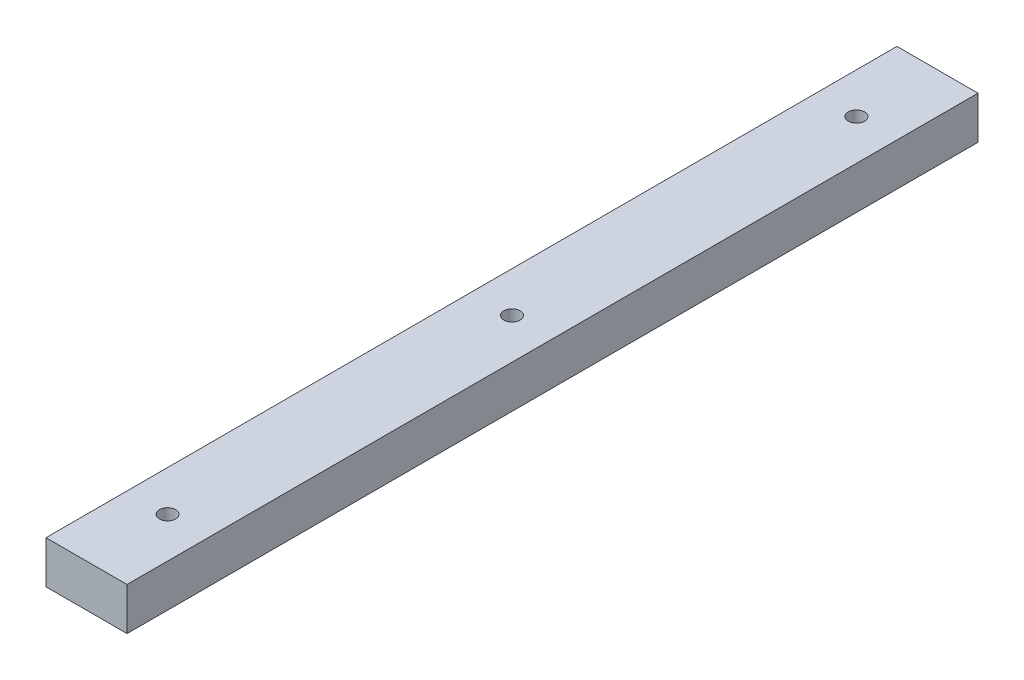
ISO-10303-21;
HEADER;
FILE_DESCRIPTION(('STEP AP214'),'2;1');
FILE_NAME('part.step','',(''),(''),'','','');
FILE_SCHEMA(('AUTOMOTIVE_DESIGN { 1 0 10303 214 1 1 1 1 }'));
ENDSEC;
DATA;
#1=APPLICATION_CONTEXT('core data for automotive mechanical design processes');
#2=APPLICATION_PROTOCOL_DEFINITION('international standard','automotive_design',2000,#1);
#3=PRODUCT_CONTEXT('',#1,'mechanical');
#4=PRODUCT('Part','Part','',(#3));
#5=PRODUCT_RELATED_PRODUCT_CATEGORY('part','',(#4));
#6=PRODUCT_DEFINITION_FORMATION('','',#4);
#7=PRODUCT_DEFINITION_CONTEXT('part definition',#1,'design');
#8=PRODUCT_DEFINITION('design','',#6,#7);
#9=PRODUCT_DEFINITION_SHAPE('','',#8);
#10=(LENGTH_UNIT() NAMED_UNIT(*) SI_UNIT(.MILLI.,.METRE.));
#11=(NAMED_UNIT(*) PLANE_ANGLE_UNIT() SI_UNIT($,.RADIAN.));
#12=(NAMED_UNIT(*) SI_UNIT($,.STERADIAN.) SOLID_ANGLE_UNIT());
#13=UNCERTAINTY_MEASURE_WITH_UNIT(LENGTH_MEASURE(1.E-05),#10,'distance_accuracy_value','');
#14=(GEOMETRIC_REPRESENTATION_CONTEXT(3) GLOBAL_UNCERTAINTY_ASSIGNED_CONTEXT((#13)) GLOBAL_UNIT_ASSIGNED_CONTEXT((#10,
#11,#12)) REPRESENTATION_CONTEXT('',''));
#15=CARTESIAN_POINT('',(0.,0.,0.));
#16=DIRECTION('',(0.,0.,1.));
#17=DIRECTION('',(1.,0.,0.));
#18=AXIS2_PLACEMENT_3D('',#15,#16,#17);
#19=CARTESIAN_POINT('',(0.,10.5,0.));
#20=DIRECTION('',(0.,-1.,0.));
#21=DIRECTION('',(0.,0.,-1.));
#22=AXIS2_PLACEMENT_3D('',#19,#20,#21);
#23=PLANE('',#22);
#24=DIRECTION('',(0.,0.,-1.));
#25=VECTOR('',#24,1.);
#26=CARTESIAN_POINT('',(10.0000000000001,10.5,105.));
#27=LINE('',#26,#25);
#28=CARTESIAN_POINT('',(10.0000000000001,10.5,105.));
#29=VERTEX_POINT('',#28);
#30=CARTESIAN_POINT('',(10.0000000000001,10.5,-105.));
#31=VERTEX_POINT('',#30);
#32=EDGE_CURVE('E96',#29,#31,#27,.T.);
#33=ORIENTED_EDGE('',*,*,#32,.T.);
#34=DIRECTION('',(-1.,0.,0.));
#35=VECTOR('',#34,1.);
#36=CARTESIAN_POINT('',(-9.99999999999994,10.5,-105.));
#37=LINE('',#36,#35);
#38=CARTESIAN_POINT('',(-9.99999999999994,10.5,-105.));
#39=VERTEX_POINT('',#38);
#40=EDGE_CURVE('E91',#31,#39,#37,.T.);
#41=ORIENTED_EDGE('',*,*,#40,.T.);
#42=DIRECTION('',(0.,0.,1.));
#43=VECTOR('',#42,1.);
#44=CARTESIAN_POINT('',(-10.0000000000001,10.5,105.));
#45=LINE('',#44,#43);
#46=CARTESIAN_POINT('',(-10.0000000000001,10.5,105.));
#47=VERTEX_POINT('',#46);
#48=EDGE_CURVE('E94',#39,#47,#45,.T.);
#49=ORIENTED_EDGE('',*,*,#48,.T.);
#50=DIRECTION('',(1.,0.,0.));
#51=VECTOR('',#50,1.);
#52=CARTESIAN_POINT('',(-10.0000000000001,10.5,105.));
#53=LINE('',#52,#51);
#54=EDGE_CURVE('E61',#47,#29,#53,.T.);
#55=ORIENTED_EDGE('',*,*,#54,.T.);
#56=EDGE_LOOP('',(#33,#41,#49,#55));
#57=FACE_BOUND('',#56,.T.);
#58=CARTESIAN_POINT('',(0.,10.5,-84.9999999999999));
#59=DIRECTION('',(0.,1.,0.));
#60=DIRECTION('',(0.,0.,1.));
#61=AXIS2_PLACEMENT_3D('',#58,#59,#60);
#62=CIRCLE('',#61,2.);
#63=CARTESIAN_POINT('',(0.,10.5,-86.9999999999999));
#64=VERTEX_POINT('',#63);
#65=EDGE_CURVE('E116',#64,#64,#62,.T.);
#66=ORIENTED_EDGE('',*,*,#65,.F.);
#67=EDGE_LOOP('',(#66));
#68=FACE_BOUND('',#67,.T.);
#69=CARTESIAN_POINT('',(0.,10.5,0.));
#70=DIRECTION('',(0.,1.,0.));
#71=DIRECTION('',(0.,0.,1.));
#72=AXIS2_PLACEMENT_3D('',#69,#70,#71);
#73=CIRCLE('',#72,2.);
#74=CARTESIAN_POINT('',(0.,10.5,-2.00000000000001));
#75=VERTEX_POINT('',#74);
#76=EDGE_CURVE('E138',#75,#75,#73,.T.);
#77=ORIENTED_EDGE('',*,*,#76,.F.);
#78=EDGE_LOOP('',(#77));
#79=FACE_BOUND('',#78,.T.);
#80=CARTESIAN_POINT('',(0.,10.5,85.0000000000001));
#81=DIRECTION('',(0.,1.,0.));
#82=DIRECTION('',(0.,0.,1.));
#83=AXIS2_PLACEMENT_3D('',#80,#81,#82);
#84=CIRCLE('',#83,2.);
#85=CARTESIAN_POINT('',(0.,10.5,83.0000000000001));
#86=VERTEX_POINT('',#85);
#87=EDGE_CURVE('E146',#86,#86,#84,.T.);
#88=ORIENTED_EDGE('',*,*,#87,.F.);
#89=EDGE_LOOP('',(#88));
#90=FACE_BOUND('',#89,.T.);
#91=ADVANCED_FACE('F43',(#57,#68,#79,#90),#23,.F.);
#92=CARTESIAN_POINT('',(0.,0.,0.));
#93=DIRECTION('',(0.,-1.,0.));
#94=DIRECTION('',(0.,0.,-1.));
#95=AXIS2_PLACEMENT_3D('',#92,#93,#94);
#96=PLANE('',#95);
#97=CARTESIAN_POINT('',(0.,0.,0.));
#98=DIRECTION('',(0.,1.,0.));
#99=DIRECTION('',(0.,0.,1.));
#100=AXIS2_PLACEMENT_3D('',#97,#98,#99);
#101=CIRCLE('',#100,2.);
#102=CARTESIAN_POINT('',(0.,0.,-2.00000000000001));
#103=VERTEX_POINT('',#102);
#104=EDGE_CURVE('E142',#103,#103,#101,.T.);
#105=ORIENTED_EDGE('',*,*,#104,.T.);
#106=EDGE_LOOP('',(#105));
#107=FACE_BOUND('',#106,.T.);
#108=DIRECTION('',(0.,0.,-1.));
#109=VECTOR('',#108,1.);
#110=CARTESIAN_POINT('',(10.0000000000001,0.,105.));
#111=LINE('',#110,#109);
#112=CARTESIAN_POINT('',(10.0000000000001,0.,105.));
#113=VERTEX_POINT('',#112);
#114=CARTESIAN_POINT('',(10.0000000000001,0.,-105.));
#115=VERTEX_POINT('',#114);
#116=EDGE_CURVE('E112',#113,#115,#111,.T.);
#117=ORIENTED_EDGE('',*,*,#116,.F.);
#118=DIRECTION('',(1.,0.,0.));
#119=VECTOR('',#118,1.);
#120=CARTESIAN_POINT('',(-10.0000000000001,0.,105.));
#121=LINE('',#120,#119);
#122=CARTESIAN_POINT('',(-10.0000000000001,0.,105.));
#123=VERTEX_POINT('',#122);
#124=EDGE_CURVE('E84',#123,#113,#121,.T.);
#125=ORIENTED_EDGE('',*,*,#124,.F.);
#126=DIRECTION('',(0.,0.,1.));
#127=VECTOR('',#126,1.);
#128=CARTESIAN_POINT('',(-10.0000000000001,0.,105.));
#129=LINE('',#128,#127);
#130=CARTESIAN_POINT('',(-9.99999999999994,0.,-105.));
#131=VERTEX_POINT('',#130);
#132=EDGE_CURVE('E78',#131,#123,#129,.T.);
#133=ORIENTED_EDGE('',*,*,#132,.F.);
#134=DIRECTION('',(-1.,0.,0.));
#135=VECTOR('',#134,1.);
#136=CARTESIAN_POINT('',(-9.99999999999994,0.,-105.));
#137=LINE('',#136,#135);
#138=EDGE_CURVE('E101',#115,#131,#137,.T.);
#139=ORIENTED_EDGE('',*,*,#138,.F.);
#140=EDGE_LOOP('',(#117,#125,#133,#139));
#141=FACE_BOUND('',#140,.T.);
#142=CARTESIAN_POINT('',(0.,0.,-84.9999999999999));
#143=DIRECTION('',(0.,1.,0.));
#144=DIRECTION('',(0.,0.,1.));
#145=AXIS2_PLACEMENT_3D('',#142,#143,#144);
#146=CIRCLE('',#145,2.);
#147=CARTESIAN_POINT('',(0.,0.,-86.9999999999999));
#148=VERTEX_POINT('',#147);
#149=EDGE_CURVE('E134',#148,#148,#146,.T.);
#150=ORIENTED_EDGE('',*,*,#149,.T.);
#151=EDGE_LOOP('',(#150));
#152=FACE_BOUND('',#151,.T.);
#153=CARTESIAN_POINT('',(0.,0.,85.0000000000001));
#154=DIRECTION('',(0.,1.,0.));
#155=DIRECTION('',(0.,0.,1.));
#156=AXIS2_PLACEMENT_3D('',#153,#154,#155);
#157=CIRCLE('',#156,2.);
#158=CARTESIAN_POINT('',(0.,0.,83.0000000000001));
#159=VERTEX_POINT('',#158);
#160=EDGE_CURVE('E150',#159,#159,#157,.T.);
#161=ORIENTED_EDGE('',*,*,#160,.T.);
#162=EDGE_LOOP('',(#161));
#163=FACE_BOUND('',#162,.T.);
#164=ADVANCED_FACE('F129',(#107,#141,#152,#163),#96,.T.);
#165=CARTESIAN_POINT('',(10.0000000000001,10.5,105.));
#166=DIRECTION('',(-1.,0.,0.));
#167=DIRECTION('',(0.,0.,1.));
#168=AXIS2_PLACEMENT_3D('',#165,#166,#167);
#169=PLANE('',#168);
#170=ORIENTED_EDGE('',*,*,#116,.T.);
#171=DIRECTION('',(0.,-1.,0.));
#172=VECTOR('',#171,1.);
#173=CARTESIAN_POINT('',(10.0000000000001,10.5,-105.));
#174=LINE('',#173,#172);
#175=EDGE_CURVE('E11',#31,#115,#174,.T.);
#176=ORIENTED_EDGE('',*,*,#175,.F.);
#177=ORIENTED_EDGE('',*,*,#32,.F.);
#178=DIRECTION('',(0.,-1.,0.));
#179=VECTOR('',#178,1.);
#180=CARTESIAN_POINT('',(10.0000000000001,10.5,105.));
#181=LINE('',#180,#179);
#182=EDGE_CURVE('E108',#29,#113,#181,.T.);
#183=ORIENTED_EDGE('',*,*,#182,.T.);
#184=EDGE_LOOP('',(#170,#176,#177,#183));
#185=FACE_BOUND('',#184,.T.);
#186=ADVANCED_FACE('F45',(#185),#169,.F.);
#187=CARTESIAN_POINT('',(-9.99999999999994,10.5,-105.));
#188=DIRECTION('',(0.,0.,1.));
#189=DIRECTION('',(1.,0.,0.));
#190=AXIS2_PLACEMENT_3D('',#187,#188,#189);
#191=PLANE('',#190);
#192=ORIENTED_EDGE('',*,*,#138,.T.);
#193=DIRECTION('',(0.,-1.,0.));
#194=VECTOR('',#193,1.);
#195=CARTESIAN_POINT('',(-9.99999999999994,10.5,-105.));
#196=LINE('',#195,#194);
#197=EDGE_CURVE('E53',#39,#131,#196,.T.);
#198=ORIENTED_EDGE('',*,*,#197,.F.);
#199=ORIENTED_EDGE('',*,*,#40,.F.);
#200=ORIENTED_EDGE('',*,*,#175,.T.);
#201=EDGE_LOOP('',(#192,#198,#199,#200));
#202=FACE_BOUND('',#201,.T.);
#203=ADVANCED_FACE('F100',(#202),#191,.F.);
#204=CARTESIAN_POINT('',(-10.0000000000001,10.5,105.));
#205=DIRECTION('',(1.,0.,0.));
#206=DIRECTION('',(0.,0.,-1.));
#207=AXIS2_PLACEMENT_3D('',#204,#205,#206);
#208=PLANE('',#207);
#209=ORIENTED_EDGE('',*,*,#132,.T.);
#210=DIRECTION('',(0.,-1.,0.));
#211=VECTOR('',#210,1.);
#212=CARTESIAN_POINT('',(-10.0000000000001,10.5,105.));
#213=LINE('',#212,#211);
#214=EDGE_CURVE('E103',#47,#123,#213,.T.);
#215=ORIENTED_EDGE('',*,*,#214,.F.);
#216=ORIENTED_EDGE('',*,*,#48,.F.);
#217=ORIENTED_EDGE('',*,*,#197,.T.);
#218=EDGE_LOOP('',(#209,#215,#216,#217));
#219=FACE_BOUND('',#218,.T.);
#220=ADVANCED_FACE('F104',(#219),#208,.F.);
#221=CARTESIAN_POINT('',(-10.0000000000001,10.5,105.));
#222=DIRECTION('',(0.,0.,-1.));
#223=DIRECTION('',(-1.,0.,0.));
#224=AXIS2_PLACEMENT_3D('',#221,#222,#223);
#225=PLANE('',#224);
#226=ORIENTED_EDGE('',*,*,#124,.T.);
#227=ORIENTED_EDGE('',*,*,#182,.F.);
#228=ORIENTED_EDGE('',*,*,#54,.F.);
#229=ORIENTED_EDGE('',*,*,#214,.T.);
#230=EDGE_LOOP('',(#226,#227,#228,#229));
#231=FACE_BOUND('',#230,.T.);
#232=ADVANCED_FACE('F126',(#231),#225,.F.);
#233=CARTESIAN_POINT('',(0.,10.5,-84.9999999999999));
#234=DIRECTION('',(0.,-1.,0.));
#235=DIRECTION('',(0.,0.,-1.));
#236=AXIS2_PLACEMENT_3D('',#233,#234,#235);
#237=CYLINDRICAL_SURFACE('',#236,2.);
#238=CARTESIAN_POINT('',(0.,10.5,-86.9999999999999));
#239=CARTESIAN_POINT('',(0.,10.390625,-86.9999999999999));
#240=CARTESIAN_POINT('',(0.,10.28125,-86.9999999999999));
#241=CARTESIAN_POINT('',(0.,10.0625,-86.9999999999999));
#242=CARTESIAN_POINT('',(0.,9.953125,-86.9999999999999));
#243=CARTESIAN_POINT('',(0.,9.734375,-86.9999999999999));
#244=CARTESIAN_POINT('',(0.,9.625,-86.9999999999999));
#245=CARTESIAN_POINT('',(0.,9.40625,-86.9999999999999));
#246=CARTESIAN_POINT('',(0.,9.296875,-86.9999999999999));
#247=CARTESIAN_POINT('',(0.,9.078125,-86.9999999999999));
#248=CARTESIAN_POINT('',(0.,8.96875,-86.9999999999999));
#249=CARTESIAN_POINT('',(0.,8.75,-86.9999999999999));
#250=CARTESIAN_POINT('',(0.,8.640625,-86.9999999999999));
#251=CARTESIAN_POINT('',(0.,8.421875,-86.9999999999999));
#252=CARTESIAN_POINT('',(0.,8.3125,-86.9999999999999));
#253=CARTESIAN_POINT('',(0.,8.09375,-86.9999999999999));
#254=CARTESIAN_POINT('',(0.,7.984375,-86.9999999999999));
#255=CARTESIAN_POINT('',(0.,7.765625,-86.9999999999999));
#256=CARTESIAN_POINT('',(0.,7.65625,-86.9999999999999));
#257=CARTESIAN_POINT('',(0.,7.4375,-86.9999999999999));
#258=CARTESIAN_POINT('',(0.,7.328125,-86.9999999999999));
#259=CARTESIAN_POINT('',(0.,7.109375,-86.9999999999999));
#260=CARTESIAN_POINT('',(0.,7.,-86.9999999999999));
#261=CARTESIAN_POINT('',(0.,6.78125,-86.9999999999999));
#262=CARTESIAN_POINT('',(0.,6.671875,-86.9999999999999));
#263=CARTESIAN_POINT('',(0.,6.453125,-86.9999999999999));
#264=CARTESIAN_POINT('',(0.,6.34375,-86.9999999999999));
#265=CARTESIAN_POINT('',(0.,6.125,-86.9999999999999));
#266=CARTESIAN_POINT('',(0.,6.015625,-86.9999999999999));
#267=CARTESIAN_POINT('',(0.,5.796875,-86.9999999999999));
#268=CARTESIAN_POINT('',(0.,5.6875,-86.9999999999999));
#269=CARTESIAN_POINT('',(0.,5.46875,-86.9999999999999));
#270=CARTESIAN_POINT('',(0.,5.359375,-86.9999999999999));
#271=CARTESIAN_POINT('',(0.,5.140625,-86.9999999999999));
#272=CARTESIAN_POINT('',(0.,5.03125,-86.9999999999999));
#273=CARTESIAN_POINT('',(0.,4.8125,-86.9999999999999));
#274=CARTESIAN_POINT('',(0.,4.703125,-86.9999999999999));
#275=CARTESIAN_POINT('',(0.,4.484375,-86.9999999999999));
#276=CARTESIAN_POINT('',(0.,4.375,-86.9999999999999));
#277=CARTESIAN_POINT('',(0.,4.15625,-86.9999999999999));
#278=CARTESIAN_POINT('',(0.,4.046875,-86.9999999999999));
#279=CARTESIAN_POINT('',(0.,3.828125,-86.9999999999999));
#280=CARTESIAN_POINT('',(0.,3.71875,-86.9999999999999));
#281=CARTESIAN_POINT('',(0.,3.5,-86.9999999999999));
#282=CARTESIAN_POINT('',(0.,3.390625,-86.9999999999999));
#283=CARTESIAN_POINT('',(0.,3.171875,-86.9999999999999));
#284=CARTESIAN_POINT('',(0.,3.0625,-86.9999999999999));
#285=CARTESIAN_POINT('',(0.,2.84375,-86.9999999999999));
#286=CARTESIAN_POINT('',(0.,2.734375,-86.9999999999999));
#287=CARTESIAN_POINT('',(0.,2.515625,-86.9999999999999));
#288=CARTESIAN_POINT('',(0.,2.40625,-86.9999999999999));
#289=CARTESIAN_POINT('',(0.,2.1875,-86.9999999999999));
#290=CARTESIAN_POINT('',(0.,2.078125,-86.9999999999999));
#291=CARTESIAN_POINT('',(0.,1.859375,-86.9999999999999));
#292=CARTESIAN_POINT('',(0.,1.75,-86.9999999999999));
#293=CARTESIAN_POINT('',(0.,1.53125,-86.9999999999999));
#294=CARTESIAN_POINT('',(0.,1.421875,-86.9999999999999));
#295=CARTESIAN_POINT('',(0.,1.203125,-86.9999999999999));
#296=CARTESIAN_POINT('',(0.,1.09375,-86.9999999999999));
#297=CARTESIAN_POINT('',(0.,0.875000000000001,-86.9999999999999));
#298=CARTESIAN_POINT('',(0.,0.765625000000001,-86.9999999999999));
#299=CARTESIAN_POINT('',(0.,0.546875,-86.9999999999999));
#300=CARTESIAN_POINT('',(0.,0.4375,-86.9999999999999));
#301=CARTESIAN_POINT('',(0.,0.21875,-86.9999999999999));
#302=CARTESIAN_POINT('',(0.,0.109375,-86.9999999999999));
#303=CARTESIAN_POINT('',(0.,0.,-86.9999999999999));
#304=B_SPLINE_CURVE_WITH_KNOTS('',3,(#238,#239,#240,#241,#242,#243,#244,#245,#246,#247,#248,
#249,#250,#251,#252,#253,#254,#255,#256,#257,#258,#259,#260,#261,#262,#263,#264,#265,#266,#267,
#268,#269,#270,#271,#272,#273,#274,#275,#276,#277,#278,#279,#280,#281,#282,#283,#284,#285,#286,
#287,#288,#289,#290,#291,#292,#293,#294,#295,#296,#297,#298,#299,#300,#301,#302,#303),
.UNSPECIFIED.,.F.,.F.,(4,2,2,2,2,2,2,2,2,2,2,2,2,2,2,2,2,2,2,2,2,2,2,2,2,2,2,2,2,2,2,2,4),(0.,
0.328124999999999,0.656249999999999,0.984374999999999,1.3125,1.640625,1.96875,2.296875,2.625,
2.953125,3.28125,3.609375,3.9375,4.265625,4.59375,4.921875,5.25,5.578125,5.90625,6.234375,
6.5625,6.890625,7.21875,7.546875,7.875,8.203125,8.53125,8.859375,9.1875,9.515625,9.84375,
10.171875,10.5),.UNSPECIFIED.);
#305=EDGE_CURVE('BSEAM169',#64,#148,#304,.T.);
#306=ORIENTED_EDGE('',*,*,#65,.T.);
#307=ORIENTED_EDGE('',*,*,#149,.F.);
#308=ORIENTED_EDGE('',*,*,#305,.T.);
#309=ORIENTED_EDGE('',*,*,#305,.F.);
#310=EDGE_LOOP('',(#306,#308,#307,#309));
#311=FACE_BOUND('',#310,.T.);
#312=ADVANCED_FACE('F169',(#311),#237,.F.);
#313=CARTESIAN_POINT('',(0.,10.5,0.));
#314=DIRECTION('',(0.,-1.,0.));
#315=DIRECTION('',(0.,0.,-1.));
#316=AXIS2_PLACEMENT_3D('',#313,#314,#315);
#317=CYLINDRICAL_SURFACE('',#316,2.);
#318=CARTESIAN_POINT('',(0.,10.5,-2.00000000000001));
#319=CARTESIAN_POINT('',(0.,10.390625,-2.00000000000001));
#320=CARTESIAN_POINT('',(0.,10.28125,-2.00000000000001));
#321=CARTESIAN_POINT('',(0.,10.0625,-2.00000000000001));
#322=CARTESIAN_POINT('',(0.,9.953125,-2.00000000000001));
#323=CARTESIAN_POINT('',(0.,9.734375,-2.00000000000001));
#324=CARTESIAN_POINT('',(0.,9.625,-2.00000000000001));
#325=CARTESIAN_POINT('',(0.,9.40625,-2.00000000000001));
#326=CARTESIAN_POINT('',(0.,9.296875,-2.00000000000001));
#327=CARTESIAN_POINT('',(0.,9.078125,-2.00000000000001));
#328=CARTESIAN_POINT('',(0.,8.96875,-2.00000000000001));
#329=CARTESIAN_POINT('',(0.,8.75,-2.00000000000001));
#330=CARTESIAN_POINT('',(0.,8.640625,-2.00000000000001));
#331=CARTESIAN_POINT('',(0.,8.421875,-2.00000000000001));
#332=CARTESIAN_POINT('',(0.,8.3125,-2.00000000000001));
#333=CARTESIAN_POINT('',(0.,8.09375,-2.00000000000001));
#334=CARTESIAN_POINT('',(0.,7.984375,-2.00000000000001));
#335=CARTESIAN_POINT('',(0.,7.765625,-2.00000000000001));
#336=CARTESIAN_POINT('',(0.,7.65625,-2.00000000000001));
#337=CARTESIAN_POINT('',(0.,7.4375,-2.00000000000001));
#338=CARTESIAN_POINT('',(0.,7.328125,-2.00000000000001));
#339=CARTESIAN_POINT('',(0.,7.109375,-2.00000000000001));
#340=CARTESIAN_POINT('',(0.,7.,-2.00000000000001));
#341=CARTESIAN_POINT('',(0.,6.78125,-2.00000000000001));
#342=CARTESIAN_POINT('',(0.,6.671875,-2.00000000000001));
#343=CARTESIAN_POINT('',(0.,6.453125,-2.00000000000001));
#344=CARTESIAN_POINT('',(0.,6.34375,-2.00000000000001));
#345=CARTESIAN_POINT('',(0.,6.125,-2.00000000000001));
#346=CARTESIAN_POINT('',(0.,6.015625,-2.00000000000001));
#347=CARTESIAN_POINT('',(0.,5.796875,-2.00000000000001));
#348=CARTESIAN_POINT('',(0.,5.6875,-2.00000000000001));
#349=CARTESIAN_POINT('',(0.,5.46875,-2.00000000000001));
#350=CARTESIAN_POINT('',(0.,5.359375,-2.00000000000001));
#351=CARTESIAN_POINT('',(0.,5.140625,-2.00000000000001));
#352=CARTESIAN_POINT('',(0.,5.03125,-2.00000000000001));
#353=CARTESIAN_POINT('',(0.,4.8125,-2.00000000000001));
#354=CARTESIAN_POINT('',(0.,4.703125,-2.00000000000001));
#355=CARTESIAN_POINT('',(0.,4.484375,-2.00000000000001));
#356=CARTESIAN_POINT('',(0.,4.375,-2.00000000000001));
#357=CARTESIAN_POINT('',(0.,4.15625,-2.00000000000001));
#358=CARTESIAN_POINT('',(0.,4.046875,-2.00000000000001));
#359=CARTESIAN_POINT('',(0.,3.828125,-2.00000000000001));
#360=CARTESIAN_POINT('',(0.,3.71875,-2.00000000000001));
#361=CARTESIAN_POINT('',(0.,3.5,-2.00000000000001));
#362=CARTESIAN_POINT('',(0.,3.390625,-2.00000000000001));
#363=CARTESIAN_POINT('',(0.,3.171875,-2.00000000000001));
#364=CARTESIAN_POINT('',(0.,3.0625,-2.00000000000001));
#365=CARTESIAN_POINT('',(0.,2.84375,-2.00000000000001));
#366=CARTESIAN_POINT('',(0.,2.734375,-2.00000000000001));
#367=CARTESIAN_POINT('',(0.,2.515625,-2.00000000000001));
#368=CARTESIAN_POINT('',(0.,2.40625,-2.00000000000001));
#369=CARTESIAN_POINT('',(0.,2.1875,-2.00000000000001));
#370=CARTESIAN_POINT('',(0.,2.078125,-2.00000000000001));
#371=CARTESIAN_POINT('',(0.,1.859375,-2.00000000000001));
#372=CARTESIAN_POINT('',(0.,1.75,-2.00000000000001));
#373=CARTESIAN_POINT('',(0.,1.53125,-2.00000000000001));
#374=CARTESIAN_POINT('',(0.,1.421875,-2.00000000000001));
#375=CARTESIAN_POINT('',(0.,1.203125,-2.00000000000001));
#376=CARTESIAN_POINT('',(0.,1.09375,-2.00000000000001));
#377=CARTESIAN_POINT('',(0.,0.875000000000001,-2.00000000000001));
#378=CARTESIAN_POINT('',(0.,0.765625000000001,-2.00000000000001));
#379=CARTESIAN_POINT('',(0.,0.546875,-2.00000000000001));
#380=CARTESIAN_POINT('',(0.,0.4375,-2.00000000000001));
#381=CARTESIAN_POINT('',(0.,0.21875,-2.00000000000001));
#382=CARTESIAN_POINT('',(0.,0.109375,-2.00000000000001));
#383=CARTESIAN_POINT('',(0.,0.,-2.00000000000001));
#384=B_SPLINE_CURVE_WITH_KNOTS('',3,(#318,#319,#320,#321,#322,#323,#324,#325,#326,#327,#328,
#329,#330,#331,#332,#333,#334,#335,#336,#337,#338,#339,#340,#341,#342,#343,#344,#345,#346,#347,
#348,#349,#350,#351,#352,#353,#354,#355,#356,#357,#358,#359,#360,#361,#362,#363,#364,#365,#366,
#367,#368,#369,#370,#371,#372,#373,#374,#375,#376,#377,#378,#379,#380,#381,#382,#383),
.UNSPECIFIED.,.F.,.F.,(4,2,2,2,2,2,2,2,2,2,2,2,2,2,2,2,2,2,2,2,2,2,2,2,2,2,2,2,2,2,2,2,4),(0.,
0.328124999999999,0.656249999999999,0.984374999999999,1.3125,1.640625,1.96875,2.296875,2.625,
2.953125,3.28125,3.609375,3.9375,4.265625,4.59375,4.921875,5.25,5.578125,5.90625,6.234375,
6.5625,6.890625,7.21875,7.546875,7.875,8.203125,8.53125,8.859375,9.1875,9.515625,9.84375,
10.171875,10.5),.UNSPECIFIED.);
#385=EDGE_CURVE('BSEAM223',#75,#103,#384,.T.);
#386=ORIENTED_EDGE('',*,*,#76,.T.);
#387=ORIENTED_EDGE('',*,*,#104,.F.);
#388=ORIENTED_EDGE('',*,*,#385,.T.);
#389=ORIENTED_EDGE('',*,*,#385,.F.);
#390=EDGE_LOOP('',(#386,#388,#387,#389));
#391=FACE_BOUND('',#390,.T.);
#392=ADVANCED_FACE('F223',(#391),#317,.F.);
#393=CARTESIAN_POINT('',(0.,10.5,85.0000000000001));
#394=DIRECTION('',(0.,-1.,0.));
#395=DIRECTION('',(0.,0.,-1.));
#396=AXIS2_PLACEMENT_3D('',#393,#394,#395);
#397=CYLINDRICAL_SURFACE('',#396,2.);
#398=CARTESIAN_POINT('',(0.,10.5,83.0000000000001));
#399=CARTESIAN_POINT('',(0.,10.390625,83.0000000000001));
#400=CARTESIAN_POINT('',(0.,10.28125,83.0000000000001));
#401=CARTESIAN_POINT('',(0.,10.0625,83.0000000000001));
#402=CARTESIAN_POINT('',(0.,9.953125,83.0000000000001));
#403=CARTESIAN_POINT('',(0.,9.734375,83.0000000000001));
#404=CARTESIAN_POINT('',(0.,9.625,83.0000000000001));
#405=CARTESIAN_POINT('',(0.,9.40625,83.0000000000001));
#406=CARTESIAN_POINT('',(0.,9.296875,83.0000000000001));
#407=CARTESIAN_POINT('',(0.,9.078125,83.0000000000001));
#408=CARTESIAN_POINT('',(0.,8.96875,83.0000000000001));
#409=CARTESIAN_POINT('',(0.,8.75,83.0000000000001));
#410=CARTESIAN_POINT('',(0.,8.640625,83.0000000000001));
#411=CARTESIAN_POINT('',(0.,8.421875,83.0000000000001));
#412=CARTESIAN_POINT('',(0.,8.3125,83.0000000000001));
#413=CARTESIAN_POINT('',(0.,8.09375,83.0000000000001));
#414=CARTESIAN_POINT('',(0.,7.984375,83.0000000000001));
#415=CARTESIAN_POINT('',(0.,7.765625,83.0000000000001));
#416=CARTESIAN_POINT('',(0.,7.65625,83.0000000000001));
#417=CARTESIAN_POINT('',(0.,7.4375,83.0000000000001));
#418=CARTESIAN_POINT('',(0.,7.328125,83.0000000000001));
#419=CARTESIAN_POINT('',(0.,7.109375,83.0000000000001));
#420=CARTESIAN_POINT('',(0.,7.,83.0000000000001));
#421=CARTESIAN_POINT('',(0.,6.78125,83.0000000000001));
#422=CARTESIAN_POINT('',(0.,6.671875,83.0000000000001));
#423=CARTESIAN_POINT('',(0.,6.453125,83.0000000000001));
#424=CARTESIAN_POINT('',(0.,6.34375,83.0000000000001));
#425=CARTESIAN_POINT('',(0.,6.125,83.0000000000001));
#426=CARTESIAN_POINT('',(0.,6.015625,83.0000000000001));
#427=CARTESIAN_POINT('',(0.,5.796875,83.0000000000001));
#428=CARTESIAN_POINT('',(0.,5.6875,83.0000000000001));
#429=CARTESIAN_POINT('',(0.,5.46875,83.0000000000001));
#430=CARTESIAN_POINT('',(0.,5.359375,83.0000000000001));
#431=CARTESIAN_POINT('',(0.,5.140625,83.0000000000001));
#432=CARTESIAN_POINT('',(0.,5.03125,83.0000000000001));
#433=CARTESIAN_POINT('',(0.,4.8125,83.0000000000001));
#434=CARTESIAN_POINT('',(0.,4.703125,83.0000000000001));
#435=CARTESIAN_POINT('',(0.,4.484375,83.0000000000001));
#436=CARTESIAN_POINT('',(0.,4.375,83.0000000000001));
#437=CARTESIAN_POINT('',(0.,4.15625,83.0000000000001));
#438=CARTESIAN_POINT('',(0.,4.046875,83.0000000000001));
#439=CARTESIAN_POINT('',(0.,3.828125,83.0000000000001));
#440=CARTESIAN_POINT('',(0.,3.71875,83.0000000000001));
#441=CARTESIAN_POINT('',(0.,3.5,83.0000000000001));
#442=CARTESIAN_POINT('',(0.,3.390625,83.0000000000001));
#443=CARTESIAN_POINT('',(0.,3.171875,83.0000000000001));
#444=CARTESIAN_POINT('',(0.,3.0625,83.0000000000001));
#445=CARTESIAN_POINT('',(0.,2.84375,83.0000000000001));
#446=CARTESIAN_POINT('',(0.,2.734375,83.0000000000001));
#447=CARTESIAN_POINT('',(0.,2.515625,83.0000000000001));
#448=CARTESIAN_POINT('',(0.,2.40625,83.0000000000001));
#449=CARTESIAN_POINT('',(0.,2.1875,83.0000000000001));
#450=CARTESIAN_POINT('',(0.,2.078125,83.0000000000001));
#451=CARTESIAN_POINT('',(0.,1.859375,83.0000000000001));
#452=CARTESIAN_POINT('',(0.,1.75,83.0000000000001));
#453=CARTESIAN_POINT('',(0.,1.53125,83.0000000000001));
#454=CARTESIAN_POINT('',(0.,1.421875,83.0000000000001));
#455=CARTESIAN_POINT('',(0.,1.203125,83.0000000000001));
#456=CARTESIAN_POINT('',(0.,1.09375,83.0000000000001));
#457=CARTESIAN_POINT('',(0.,0.875000000000001,83.0000000000001));
#458=CARTESIAN_POINT('',(0.,0.765625000000001,83.0000000000001));
#459=CARTESIAN_POINT('',(0.,0.546875,83.0000000000001));
#460=CARTESIAN_POINT('',(0.,0.4375,83.0000000000001));
#461=CARTESIAN_POINT('',(0.,0.21875,83.0000000000001));
#462=CARTESIAN_POINT('',(0.,0.109375,83.0000000000001));
#463=CARTESIAN_POINT('',(0.,0.,83.0000000000001));
#464=B_SPLINE_CURVE_WITH_KNOTS('',3,(#398,#399,#400,#401,#402,#403,#404,#405,#406,#407,#408,
#409,#410,#411,#412,#413,#414,#415,#416,#417,#418,#419,#420,#421,#422,#423,#424,#425,#426,#427,
#428,#429,#430,#431,#432,#433,#434,#435,#436,#437,#438,#439,#440,#441,#442,#443,#444,#445,#446,
#447,#448,#449,#450,#451,#452,#453,#454,#455,#456,#457,#458,#459,#460,#461,#462,#463),
.UNSPECIFIED.,.F.,.F.,(4,2,2,2,2,2,2,2,2,2,2,2,2,2,2,2,2,2,2,2,2,2,2,2,2,2,2,2,2,2,2,2,4),(0.,
0.328124999999999,0.656249999999999,0.984374999999999,1.3125,1.640625,1.96875,2.296875,2.625,
2.953125,3.28125,3.609375,3.9375,4.265625,4.59375,4.921875,5.25,5.578125,5.90625,6.234375,
6.5625,6.890625,7.21875,7.546875,7.875,8.203125,8.53125,8.859375,9.1875,9.515625,9.84375,
10.171875,10.5),.UNSPECIFIED.);
#465=EDGE_CURVE('BSEAM158',#86,#159,#464,.T.);
#466=ORIENTED_EDGE('',*,*,#87,.T.);
#467=ORIENTED_EDGE('',*,*,#160,.F.);
#468=ORIENTED_EDGE('',*,*,#465,.T.);
#469=ORIENTED_EDGE('',*,*,#465,.F.);
#470=EDGE_LOOP('',(#466,#468,#467,#469));
#471=FACE_BOUND('',#470,.T.);
#472=ADVANCED_FACE('F158',(#471),#397,.F.);
#473=CLOSED_SHELL('',(#91,#164,#186,#203,#220,#232,#312,#392,#472));
#474=MANIFOLD_SOLID_BREP('B2',#473);
#475=ADVANCED_BREP_SHAPE_REPRESENTATION('',(#18,#474),#14);
#476=SHAPE_DEFINITION_REPRESENTATION(#9,#475);
ENDSEC;
END-ISO-10303-21;
